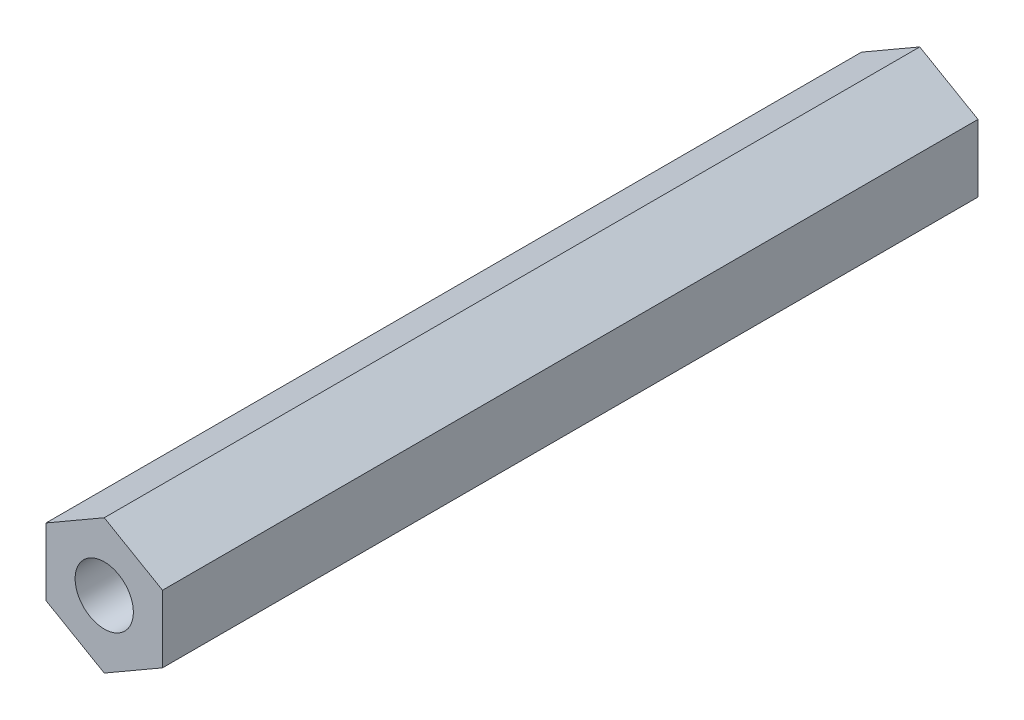
ISO-10303-21;
HEADER;
FILE_DESCRIPTION(('STEP AP214'),'2;1');
FILE_NAME('part.step','',(''),(''),'','','');
FILE_SCHEMA(('AUTOMOTIVE_DESIGN { 1 0 10303 214 1 1 1 1 }'));
ENDSEC;
DATA;
#1=APPLICATION_CONTEXT('core data for automotive mechanical design processes');
#2=APPLICATION_PROTOCOL_DEFINITION('international standard','automotive_design',2000,#1);
#3=PRODUCT_CONTEXT('',#1,'mechanical');
#4=PRODUCT('Part','Part','',(#3));
#5=PRODUCT_RELATED_PRODUCT_CATEGORY('part','',(#4));
#6=PRODUCT_DEFINITION_FORMATION('','',#4);
#7=PRODUCT_DEFINITION_CONTEXT('part definition',#1,'design');
#8=PRODUCT_DEFINITION('design','',#6,#7);
#9=PRODUCT_DEFINITION_SHAPE('','',#8);
#10=(LENGTH_UNIT() NAMED_UNIT(*) SI_UNIT(.MILLI.,.METRE.));
#11=(NAMED_UNIT(*) PLANE_ANGLE_UNIT() SI_UNIT($,.RADIAN.));
#12=(NAMED_UNIT(*) SI_UNIT($,.STERADIAN.) SOLID_ANGLE_UNIT());
#13=UNCERTAINTY_MEASURE_WITH_UNIT(LENGTH_MEASURE(1.E-05),#10,'distance_accuracy_value','');
#14=(GEOMETRIC_REPRESENTATION_CONTEXT(3) GLOBAL_UNCERTAINTY_ASSIGNED_CONTEXT((#13)) GLOBAL_UNIT_ASSIGNED_CONTEXT((#10,
#11,#12)) REPRESENTATION_CONTEXT('',''));
#15=CARTESIAN_POINT('',(0.,0.,0.));
#16=DIRECTION('',(0.,0.,1.));
#17=DIRECTION('',(1.,0.,0.));
#18=AXIS2_PLACEMENT_3D('',#15,#16,#17);
#19=CARTESIAN_POINT('',(0.,0.,6.99999999989132));
#20=DIRECTION('',(0.,0.,1.));
#21=DIRECTION('',(1.,0.,0.));
#22=AXIS2_PLACEMENT_3D('',#19,#20,#21);
#23=CONICAL_SURFACE('',#22,1.24999999985675,1.02974425843443);
#24=CARTESIAN_POINT('',(-2.27373675443232E-10,0.,6.24892422607104));
#25=VERTEX_POINT('',#24);
#26=VERTEX_LOOP('',#25);
#27=FACE_BOUND('',#26,.T.);
#28=CARTESIAN_POINT('',(0.,0.,7.));
#29=DIRECTION('',(0.,0.,1.));
#30=DIRECTION('',(1.,0.,0.));
#31=AXIS2_PLACEMENT_3D('',#28,#29,#30);
#32=CIRCLE('',#31,1.25);
#33=CARTESIAN_POINT('',(1.25,0.,7.));
#34=VERTEX_POINT('',#33);
#35=EDGE_CURVE('E77',#34,#34,#32,.T.);
#36=ORIENTED_EDGE('',*,*,#35,.T.);
#37=EDGE_LOOP('',(#36));
#38=FACE_BOUND('',#37,.T.);
#39=ADVANCED_FACE('F16',(#27,#38),#23,.F.);
#40=CARTESIAN_POINT('',(0.,0.,-6.99999999989132));
#41=DIRECTION('',(0.,0.,-1.));
#42=DIRECTION('',(-1.,0.,0.));
#43=AXIS2_PLACEMENT_3D('',#40,#41,#42);
#44=CONICAL_SURFACE('',#43,1.24999999985675,1.02974425843443);
#45=CARTESIAN_POINT('',(-2.27373675443232E-10,0.,-6.24892422607104));
#46=VERTEX_POINT('',#45);
#47=VERTEX_LOOP('',#46);
#48=FACE_BOUND('',#47,.T.);
#49=CARTESIAN_POINT('',(0.,0.,-7.));
#50=DIRECTION('',(0.,0.,-1.));
#51=DIRECTION('',(-1.,0.,0.));
#52=AXIS2_PLACEMENT_3D('',#49,#50,#51);
#53=CIRCLE('',#52,1.25);
#54=CARTESIAN_POINT('',(-1.25,0.,-7.));
#55=VERTEX_POINT('',#54);
#56=EDGE_CURVE('E79',#55,#55,#53,.T.);
#57=ORIENTED_EDGE('',*,*,#56,.T.);
#58=EDGE_LOOP('',(#57));
#59=FACE_BOUND('',#58,.T.);
#60=ADVANCED_FACE('F74',(#48,#59),#44,.F.);
#61=CARTESIAN_POINT('',(0.,0.,17.5));
#62=DIRECTION('',(0.,0.,1.));
#63=DIRECTION('',(1.,0.,0.));
#64=AXIS2_PLACEMENT_3D('',#61,#62,#63);
#65=CYLINDRICAL_SURFACE('',#64,1.25);
#66=CARTESIAN_POINT('',(0.,0.,17.5));
#67=DIRECTION('',(0.,0.,1.));
#68=DIRECTION('',(1.,0.,0.));
#69=AXIS2_PLACEMENT_3D('',#66,#67,#68);
#70=CIRCLE('',#69,1.25);
#71=CARTESIAN_POINT('',(1.25,0.,17.5));
#72=VERTEX_POINT('',#71);
#73=EDGE_CURVE('E19',#72,#72,#70,.F.);
#74=ORIENTED_EDGE('',*,*,#73,.F.);
#75=EDGE_LOOP('',(#74));
#76=FACE_BOUND('',#75,.T.);
#77=ORIENTED_EDGE('',*,*,#35,.F.);
#78=EDGE_LOOP('',(#77));
#79=FACE_BOUND('',#78,.T.);
#80=ADVANCED_FACE('F230',(#76,#79),#65,.F.);
#81=CARTESIAN_POINT('',(0.,0.,-17.5));
#82=DIRECTION('',(0.,0.,-1.));
#83=DIRECTION('',(-1.,0.,0.));
#84=AXIS2_PLACEMENT_3D('',#81,#82,#83);
#85=CYLINDRICAL_SURFACE('',#84,1.25);
#86=ORIENTED_EDGE('',*,*,#56,.F.);
#87=EDGE_LOOP('',(#86));
#88=FACE_BOUND('',#87,.T.);
#89=CARTESIAN_POINT('',(0.,0.,-17.5));
#90=DIRECTION('',(0.,0.,-1.));
#91=DIRECTION('',(-1.,0.,0.));
#92=AXIS2_PLACEMENT_3D('',#89,#90,#91);
#93=CIRCLE('',#92,1.25);
#94=CARTESIAN_POINT('',(-1.25,0.,-17.5));
#95=VERTEX_POINT('',#94);
#96=EDGE_CURVE('E85',#95,#95,#93,.T.);
#97=ORIENTED_EDGE('',*,*,#96,.T.);
#98=EDGE_LOOP('',(#97));
#99=FACE_BOUND('',#98,.T.);
#100=ADVANCED_FACE('F220',(#88,#99),#85,.F.);
#101=CARTESIAN_POINT('',(0.,-2.88675134594813,17.5));
#102=DIRECTION('',(-0.5,0.866025403784439,0.));
#103=DIRECTION('',(-0.866025403784439,-0.5,0.));
#104=AXIS2_PLACEMENT_3D('',#101,#102,#103);
#105=PLANE('',#104);
#106=DIRECTION('',(0.,0.,1.));
#107=VECTOR('',#106,1.);
#108=CARTESIAN_POINT('',(2.5,-1.44337567297406,17.5));
#109=LINE('',#108,#107);
#110=CARTESIAN_POINT('',(2.5,-1.44337567297406,-17.5));
#111=VERTEX_POINT('',#110);
#112=CARTESIAN_POINT('',(2.5,-1.44337567297406,17.5));
#113=VERTEX_POINT('',#112);
#114=EDGE_CURVE('E82',#111,#113,#109,.T.);
#115=ORIENTED_EDGE('',*,*,#114,.T.);
#116=DIRECTION('',(0.866025403784439,0.5,0.));
#117=VECTOR('',#116,1.);
#118=CARTESIAN_POINT('',(0.,-2.88675134594813,17.5));
#119=LINE('',#118,#117);
#120=CARTESIAN_POINT('',(0.,-2.88675134594813,17.5));
#121=VERTEX_POINT('',#120);
#122=EDGE_CURVE('E105',#121,#113,#119,.T.);
#123=ORIENTED_EDGE('',*,*,#122,.F.);
#124=DIRECTION('',(0.,0.,1.));
#125=VECTOR('',#124,1.);
#126=CARTESIAN_POINT('',(0.,-2.88675134594813,17.5));
#127=LINE('',#126,#125);
#128=CARTESIAN_POINT('',(0.,-2.88675134594813,-17.5));
#129=VERTEX_POINT('',#128);
#130=EDGE_CURVE('E88',#121,#129,#127,.F.);
#131=ORIENTED_EDGE('',*,*,#130,.T.);
#132=DIRECTION('',(0.866025403784439,0.5,0.));
#133=VECTOR('',#132,1.);
#134=CARTESIAN_POINT('',(0.,-2.88675134594813,-17.5));
#135=LINE('',#134,#133);
#136=EDGE_CURVE('E118',#129,#111,#135,.T.);
#137=ORIENTED_EDGE('',*,*,#136,.T.);
#138=EDGE_LOOP('',(#115,#123,#131,#137));
#139=FACE_BOUND('',#138,.T.);
#140=ADVANCED_FACE('F117',(#139),#105,.F.);
#141=CARTESIAN_POINT('',(2.5,-1.44337567297406,17.5));
#142=DIRECTION('',(-1.,0.,0.));
#143=DIRECTION('',(0.,0.,1.));
#144=AXIS2_PLACEMENT_3D('',#141,#142,#143);
#145=PLANE('',#144);
#146=DIRECTION('',(0.,0.,1.));
#147=VECTOR('',#146,1.);
#148=CARTESIAN_POINT('',(2.5,1.44337567297406,17.5));
#149=LINE('',#148,#147);
#150=CARTESIAN_POINT('',(2.5,1.44337567297406,-17.5));
#151=VERTEX_POINT('',#150);
#152=CARTESIAN_POINT('',(2.5,1.44337567297406,17.5));
#153=VERTEX_POINT('',#152);
#154=EDGE_CURVE('E114',#151,#153,#149,.T.);
#155=ORIENTED_EDGE('',*,*,#154,.T.);
#156=DIRECTION('',(0.,1.,0.));
#157=VECTOR('',#156,1.);
#158=CARTESIAN_POINT('',(2.5,2.88675134594813,17.5));
#159=LINE('',#158,#157);
#160=EDGE_CURVE('E99',#113,#153,#159,.T.);
#161=ORIENTED_EDGE('',*,*,#160,.F.);
#162=ORIENTED_EDGE('',*,*,#114,.F.);
#163=DIRECTION('',(0.,1.,0.));
#164=VECTOR('',#163,1.);
#165=CARTESIAN_POINT('',(2.5,2.88675134594813,-17.5));
#166=LINE('',#165,#164);
#167=EDGE_CURVE('E150',#111,#151,#166,.T.);
#168=ORIENTED_EDGE('',*,*,#167,.T.);
#169=EDGE_LOOP('',(#155,#161,#162,#168));
#170=FACE_BOUND('',#169,.T.);
#171=ADVANCED_FACE('F122',(#170),#145,.F.);
#172=CARTESIAN_POINT('',(2.5,1.44337567297406,17.5));
#173=DIRECTION('',(-0.5,-0.866025403784439,0.));
#174=DIRECTION('',(0.866025403784439,-0.5,0.));
#175=AXIS2_PLACEMENT_3D('',#172,#173,#174);
#176=PLANE('',#175);
#177=DIRECTION('',(0.,0.,1.));
#178=VECTOR('',#177,1.);
#179=CARTESIAN_POINT('',(0.,2.88675134594813,17.5));
#180=LINE('',#179,#178);
#181=CARTESIAN_POINT('',(0.,2.88675134594813,-17.5));
#182=VERTEX_POINT('',#181);
#183=CARTESIAN_POINT('',(0.,2.88675134594813,17.5));
#184=VERTEX_POINT('',#183);
#185=EDGE_CURVE('E111',#182,#184,#180,.T.);
#186=ORIENTED_EDGE('',*,*,#185,.T.);
#187=DIRECTION('',(-0.866025403784439,0.5,0.));
#188=VECTOR('',#187,1.);
#189=CARTESIAN_POINT('',(2.5,1.44337567297406,17.5));
#190=LINE('',#189,#188);
#191=EDGE_CURVE('E109',#153,#184,#190,.T.);
#192=ORIENTED_EDGE('',*,*,#191,.F.);
#193=ORIENTED_EDGE('',*,*,#154,.F.);
#194=DIRECTION('',(-0.866025403784439,0.5,0.));
#195=VECTOR('',#194,1.);
#196=CARTESIAN_POINT('',(2.5,1.44337567297406,-17.5));
#197=LINE('',#196,#195);
#198=EDGE_CURVE('E132',#151,#182,#197,.T.);
#199=ORIENTED_EDGE('',*,*,#198,.T.);
#200=EDGE_LOOP('',(#186,#192,#193,#199));
#201=FACE_BOUND('',#200,.T.);
#202=ADVANCED_FACE('F128',(#201),#176,.F.);
#203=CARTESIAN_POINT('',(0.,2.88675134594813,17.5));
#204=DIRECTION('',(0.5,-0.866025403784439,0.));
#205=DIRECTION('',(0.866025403784439,0.5,0.));
#206=AXIS2_PLACEMENT_3D('',#203,#204,#205);
#207=PLANE('',#206);
#208=DIRECTION('',(0.,0.,-1.));
#209=VECTOR('',#208,1.);
#210=CARTESIAN_POINT('',(-2.5,1.44337567297406,17.5));
#211=LINE('',#210,#209);
#212=CARTESIAN_POINT('',(-2.5,1.44337567297406,-17.5));
#213=VERTEX_POINT('',#212);
#214=CARTESIAN_POINT('',(-2.5,1.44337567297406,17.5));
#215=VERTEX_POINT('',#214);
#216=EDGE_CURVE('E137',#213,#215,#211,.F.);
#217=ORIENTED_EDGE('',*,*,#216,.T.);
#218=DIRECTION('',(-0.866025403784438,-0.5,0.));
#219=VECTOR('',#218,1.);
#220=CARTESIAN_POINT('',(0.,2.88675134594813,17.5));
#221=LINE('',#220,#219);
#222=EDGE_CURVE('E107',#184,#215,#221,.T.);
#223=ORIENTED_EDGE('',*,*,#222,.F.);
#224=ORIENTED_EDGE('',*,*,#185,.F.);
#225=DIRECTION('',(-0.866025403784438,-0.5,0.));
#226=VECTOR('',#225,1.);
#227=CARTESIAN_POINT('',(0.,2.88675134594813,-17.5));
#228=LINE('',#227,#226);
#229=EDGE_CURVE('E87',#182,#213,#228,.T.);
#230=ORIENTED_EDGE('',*,*,#229,.T.);
#231=EDGE_LOOP('',(#217,#223,#224,#230));
#232=FACE_BOUND('',#231,.T.);
#233=ADVANCED_FACE('F136',(#232),#207,.F.);
#234=CARTESIAN_POINT('',(0.,2.88675134594813,17.5));
#235=DIRECTION('',(0.,0.,1.));
#236=DIRECTION('',(1.,0.,0.));
#237=AXIS2_PLACEMENT_3D('',#234,#235,#236);
#238=PLANE('',#237);
#239=ORIENTED_EDGE('',*,*,#122,.T.);
#240=ORIENTED_EDGE('',*,*,#160,.T.);
#241=ORIENTED_EDGE('',*,*,#191,.T.);
#242=ORIENTED_EDGE('',*,*,#222,.T.);
#243=DIRECTION('',(0.,1.,0.));
#244=VECTOR('',#243,1.);
#245=CARTESIAN_POINT('',(-2.5,1.44337567297406,17.5));
#246=LINE('',#245,#244);
#247=CARTESIAN_POINT('',(-2.5,-1.44337567297407,17.5));
#248=VERTEX_POINT('',#247);
#249=EDGE_CURVE('E140',#215,#248,#246,.F.);
#250=ORIENTED_EDGE('',*,*,#249,.T.);
#251=DIRECTION('',(-0.866025403784439,0.5,0.));
#252=VECTOR('',#251,1.);
#253=CARTESIAN_POINT('',(-2.5,-1.44337567297407,17.5));
#254=LINE('',#253,#252);
#255=EDGE_CURVE('E93',#248,#121,#254,.F.);
#256=ORIENTED_EDGE('',*,*,#255,.T.);
#257=EDGE_LOOP('',(#239,#240,#241,#242,#250,#256));
#258=FACE_BOUND('',#257,.T.);
#259=ORIENTED_EDGE('',*,*,#73,.T.);
#260=EDGE_LOOP('',(#259));
#261=FACE_BOUND('',#260,.T.);
#262=ADVANCED_FACE('F125',(#258,#261),#238,.T.);
#263=CARTESIAN_POINT('',(-2.5,-1.44337567297407,17.5));
#264=DIRECTION('',(0.5,0.866025403784439,0.));
#265=DIRECTION('',(-0.866025403784439,0.5,0.));
#266=AXIS2_PLACEMENT_3D('',#263,#264,#265);
#267=PLANE('',#266);
#268=ORIENTED_EDGE('',*,*,#130,.F.);
#269=ORIENTED_EDGE('',*,*,#255,.F.);
#270=DIRECTION('',(0.,0.,-1.));
#271=VECTOR('',#270,1.);
#272=CARTESIAN_POINT('',(-2.5,-1.44337567297407,17.5));
#273=LINE('',#272,#271);
#274=CARTESIAN_POINT('',(-2.5,-1.44337567297407,-17.5));
#275=VERTEX_POINT('',#274);
#276=EDGE_CURVE('E25',#248,#275,#273,.T.);
#277=ORIENTED_EDGE('',*,*,#276,.T.);
#278=DIRECTION('',(0.866025403784439,-0.5,0.));
#279=VECTOR('',#278,1.);
#280=CARTESIAN_POINT('',(-2.5,-1.44337567297407,-17.5));
#281=LINE('',#280,#279);
#282=EDGE_CURVE('E33',#275,#129,#281,.T.);
#283=ORIENTED_EDGE('',*,*,#282,.T.);
#284=EDGE_LOOP('',(#268,#269,#277,#283));
#285=FACE_BOUND('',#284,.T.);
#286=ADVANCED_FACE('F153',(#285),#267,.F.);
#287=CARTESIAN_POINT('',(0.,2.88675134594813,-17.5));
#288=DIRECTION('',(0.,0.,1.));
#289=DIRECTION('',(1.,0.,0.));
#290=AXIS2_PLACEMENT_3D('',#287,#288,#289);
#291=PLANE('',#290);
#292=ORIENTED_EDGE('',*,*,#167,.F.);
#293=ORIENTED_EDGE('',*,*,#136,.F.);
#294=ORIENTED_EDGE('',*,*,#282,.F.);
#295=DIRECTION('',(0.,1.,0.));
#296=VECTOR('',#295,1.);
#297=CARTESIAN_POINT('',(-2.5,1.44337567297406,-17.5));
#298=LINE('',#297,#296);
#299=EDGE_CURVE('E11',#275,#213,#298,.T.);
#300=ORIENTED_EDGE('',*,*,#299,.T.);
#301=ORIENTED_EDGE('',*,*,#229,.F.);
#302=ORIENTED_EDGE('',*,*,#198,.F.);
#303=EDGE_LOOP('',(#292,#293,#294,#300,#301,#302));
#304=FACE_BOUND('',#303,.T.);
#305=ORIENTED_EDGE('',*,*,#96,.F.);
#306=EDGE_LOOP('',(#305));
#307=FACE_BOUND('',#306,.T.);
#308=ADVANCED_FACE('F155',(#304,#307),#291,.F.);
#309=CARTESIAN_POINT('',(-2.5,1.44337567297406,17.5));
#310=DIRECTION('',(1.,0.,0.));
#311=DIRECTION('',(0.,0.,-1.));
#312=AXIS2_PLACEMENT_3D('',#309,#310,#311);
#313=PLANE('',#312);
#314=ORIENTED_EDGE('',*,*,#276,.F.);
#315=ORIENTED_EDGE('',*,*,#249,.F.);
#316=ORIENTED_EDGE('',*,*,#216,.F.);
#317=ORIENTED_EDGE('',*,*,#299,.F.);
#318=EDGE_LOOP('',(#314,#315,#316,#317));
#319=FACE_BOUND('',#318,.T.);
#320=ADVANCED_FACE('F143',(#319),#313,.F.);
#321=CLOSED_SHELL('',(#39,#60,#80,#100,#140,#171,#202,#233,#262,#286,#308,#320));
#322=MANIFOLD_SOLID_BREP('B1',#321);
#323=ADVANCED_BREP_SHAPE_REPRESENTATION('',(#18,#322),#14);
#324=SHAPE_DEFINITION_REPRESENTATION(#9,#323);
ENDSEC;
END-ISO-10303-21;
